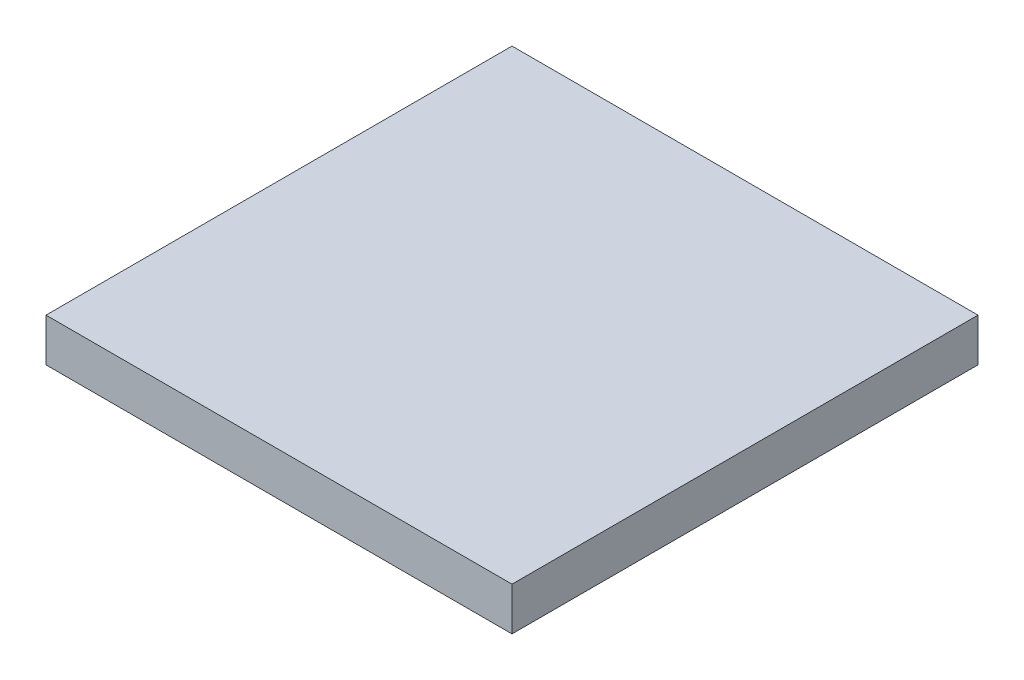
ISO-10303-21;
HEADER;
FILE_DESCRIPTION(('STEP AP214'),'2;1');
FILE_NAME('part.step','',(''),(''),'','','');
FILE_SCHEMA(('AUTOMOTIVE_DESIGN { 1 0 10303 214 1 1 1 1 }'));
ENDSEC;
DATA;
#1=APPLICATION_CONTEXT('core data for automotive mechanical design processes');
#2=APPLICATION_PROTOCOL_DEFINITION('international standard','automotive_design',2000,#1);
#3=PRODUCT_CONTEXT('',#1,'mechanical');
#4=PRODUCT('Part','Part','',(#3));
#5=PRODUCT_RELATED_PRODUCT_CATEGORY('part','',(#4));
#6=PRODUCT_DEFINITION_FORMATION('','',#4);
#7=PRODUCT_DEFINITION_CONTEXT('part definition',#1,'design');
#8=PRODUCT_DEFINITION('design','',#6,#7);
#9=PRODUCT_DEFINITION_SHAPE('','',#8);
#10=(LENGTH_UNIT() NAMED_UNIT(*) SI_UNIT(.MILLI.,.METRE.));
#11=(NAMED_UNIT(*) PLANE_ANGLE_UNIT() SI_UNIT($,.RADIAN.));
#12=(NAMED_UNIT(*) SI_UNIT($,.STERADIAN.) SOLID_ANGLE_UNIT());
#13=UNCERTAINTY_MEASURE_WITH_UNIT(LENGTH_MEASURE(1.E-05),#10,'distance_accuracy_value','');
#14=(GEOMETRIC_REPRESENTATION_CONTEXT(3) GLOBAL_UNCERTAINTY_ASSIGNED_CONTEXT((#13)) GLOBAL_UNIT_ASSIGNED_CONTEXT((#10,
#11,#12)) REPRESENTATION_CONTEXT('',''));
#15=CARTESIAN_POINT('',(0.,0.,0.));
#16=DIRECTION('',(0.,0.,1.));
#17=DIRECTION('',(1.,0.,0.));
#18=AXIS2_PLACEMENT_3D('',#15,#16,#17);
#19=CARTESIAN_POINT('',(274.6375,50.8,-274.6375));
#20=DIRECTION('',(-1.,0.,0.));
#21=DIRECTION('',(0.,0.,1.));
#22=AXIS2_PLACEMENT_3D('',#19,#20,#21);
#23=PLANE('',#22);
#24=DIRECTION('',(0.,0.,-1.));
#25=VECTOR('',#24,1.);
#26=CARTESIAN_POINT('',(274.6375,0.,-274.6375));
#27=LINE('',#26,#25);
#28=CARTESIAN_POINT('',(274.6375,0.,274.6375));
#29=VERTEX_POINT('',#28);
#30=CARTESIAN_POINT('',(274.6375,0.,-274.6375));
#31=VERTEX_POINT('',#30);
#32=EDGE_CURVE('E96',#29,#31,#27,.T.);
#33=ORIENTED_EDGE('',*,*,#32,.T.);
#34=DIRECTION('',(0.,-1.,0.));
#35=VECTOR('',#34,1.);
#36=CARTESIAN_POINT('',(274.6375,50.8,-274.6375));
#37=LINE('',#36,#35);
#38=CARTESIAN_POINT('',(274.6375,50.8,-274.6375));
#39=VERTEX_POINT('',#38);
#40=EDGE_CURVE('E11',#39,#31,#37,.T.);
#41=ORIENTED_EDGE('',*,*,#40,.F.);
#42=DIRECTION('',(0.,0.,-1.));
#43=VECTOR('',#42,1.);
#44=CARTESIAN_POINT('',(274.6375,50.8,-274.6375));
#45=LINE('',#44,#43);
#46=CARTESIAN_POINT('',(274.6375,50.8,274.6375));
#47=VERTEX_POINT('',#46);
#48=EDGE_CURVE('E84',#47,#39,#45,.T.);
#49=ORIENTED_EDGE('',*,*,#48,.F.);
#50=DIRECTION('',(0.,-1.,0.));
#51=VECTOR('',#50,1.);
#52=CARTESIAN_POINT('',(274.6375,50.8,274.6375));
#53=LINE('',#52,#51);
#54=EDGE_CURVE('E92',#47,#29,#53,.T.);
#55=ORIENTED_EDGE('',*,*,#54,.T.);
#56=EDGE_LOOP('',(#33,#41,#49,#55));
#57=FACE_BOUND('',#56,.T.);
#58=ADVANCED_FACE('F33',(#57),#23,.F.);
#59=CARTESIAN_POINT('',(-274.6375,50.8,-274.6375));
#60=DIRECTION('',(0.,0.,1.));
#61=DIRECTION('',(1.,0.,0.));
#62=AXIS2_PLACEMENT_3D('',#59,#60,#61);
#63=PLANE('',#62);
#64=DIRECTION('',(-1.,0.,0.));
#65=VECTOR('',#64,1.);
#66=CARTESIAN_POINT('',(-274.6375,0.,-274.6375));
#67=LINE('',#66,#65);
#68=CARTESIAN_POINT('',(-274.6375,0.,-274.6375));
#69=VERTEX_POINT('',#68);
#70=EDGE_CURVE('E88',#31,#69,#67,.T.);
#71=ORIENTED_EDGE('',*,*,#70,.T.);
#72=DIRECTION('',(0.,-1.,0.));
#73=VECTOR('',#72,1.);
#74=CARTESIAN_POINT('',(-274.6375,50.8,-274.6375));
#75=LINE('',#74,#73);
#76=CARTESIAN_POINT('',(-274.6375,50.8,-274.6375));
#77=VERTEX_POINT('',#76);
#78=EDGE_CURVE('E41',#77,#69,#75,.T.);
#79=ORIENTED_EDGE('',*,*,#78,.F.);
#80=DIRECTION('',(-1.,0.,0.));
#81=VECTOR('',#80,1.);
#82=CARTESIAN_POINT('',(-274.6375,50.8,-274.6375));
#83=LINE('',#82,#81);
#84=EDGE_CURVE('E79',#39,#77,#83,.T.);
#85=ORIENTED_EDGE('',*,*,#84,.F.);
#86=ORIENTED_EDGE('',*,*,#40,.T.);
#87=EDGE_LOOP('',(#71,#79,#85,#86));
#88=FACE_BOUND('',#87,.T.);
#89=ADVANCED_FACE('F87',(#88),#63,.F.);
#90=CARTESIAN_POINT('',(-274.6375,50.8,-274.6375));
#91=DIRECTION('',(1.,0.,0.));
#92=DIRECTION('',(0.,0.,-1.));
#93=AXIS2_PLACEMENT_3D('',#90,#91,#92);
#94=PLANE('',#93);
#95=DIRECTION('',(0.,0.,1.));
#96=VECTOR('',#95,1.);
#97=CARTESIAN_POINT('',(-274.6375,0.,-274.6375));
#98=LINE('',#97,#96);
#99=CARTESIAN_POINT('',(-274.6375,0.,274.6375));
#100=VERTEX_POINT('',#99);
#101=EDGE_CURVE('E66',#69,#100,#98,.T.);
#102=ORIENTED_EDGE('',*,*,#101,.T.);
#103=DIRECTION('',(0.,-1.,0.));
#104=VECTOR('',#103,1.);
#105=CARTESIAN_POINT('',(-274.6375,50.8,274.6375));
#106=LINE('',#105,#104);
#107=CARTESIAN_POINT('',(-274.6375,50.8,274.6375));
#108=VERTEX_POINT('',#107);
#109=EDGE_CURVE('E89',#108,#100,#106,.T.);
#110=ORIENTED_EDGE('',*,*,#109,.F.);
#111=DIRECTION('',(0.,0.,1.));
#112=VECTOR('',#111,1.);
#113=CARTESIAN_POINT('',(-274.6375,50.8,-274.6375));
#114=LINE('',#113,#112);
#115=EDGE_CURVE('E82',#77,#108,#114,.T.);
#116=ORIENTED_EDGE('',*,*,#115,.F.);
#117=ORIENTED_EDGE('',*,*,#78,.T.);
#118=EDGE_LOOP('',(#102,#110,#116,#117));
#119=FACE_BOUND('',#118,.T.);
#120=ADVANCED_FACE('F90',(#119),#94,.F.);
#121=CARTESIAN_POINT('',(-274.6375,50.8,274.6375));
#122=DIRECTION('',(0.,0.,-1.));
#123=DIRECTION('',(-1.,0.,0.));
#124=AXIS2_PLACEMENT_3D('',#121,#122,#123);
#125=PLANE('',#124);
#126=DIRECTION('',(1.,0.,0.));
#127=VECTOR('',#126,1.);
#128=CARTESIAN_POINT('',(-274.6375,0.,274.6375));
#129=LINE('',#128,#127);
#130=EDGE_CURVE('E72',#100,#29,#129,.T.);
#131=ORIENTED_EDGE('',*,*,#130,.T.);
#132=ORIENTED_EDGE('',*,*,#54,.F.);
#133=DIRECTION('',(1.,0.,0.));
#134=VECTOR('',#133,1.);
#135=CARTESIAN_POINT('',(-274.6375,50.8,274.6375));
#136=LINE('',#135,#134);
#137=EDGE_CURVE('E49',#108,#47,#136,.T.);
#138=ORIENTED_EDGE('',*,*,#137,.F.);
#139=ORIENTED_EDGE('',*,*,#109,.T.);
#140=EDGE_LOOP('',(#131,#132,#138,#139));
#141=FACE_BOUND('',#140,.T.);
#142=ADVANCED_FACE('F103',(#141),#125,.F.);
#143=CARTESIAN_POINT('',(0.,50.8,0.));
#144=DIRECTION('',(0.,1.,0.));
#145=DIRECTION('',(0.,0.,1.));
#146=AXIS2_PLACEMENT_3D('',#143,#144,#145);
#147=PLANE('',#146);
#148=ORIENTED_EDGE('',*,*,#48,.T.);
#149=ORIENTED_EDGE('',*,*,#84,.T.);
#150=ORIENTED_EDGE('',*,*,#115,.T.);
#151=ORIENTED_EDGE('',*,*,#137,.T.);
#152=EDGE_LOOP('',(#148,#149,#150,#151));
#153=FACE_BOUND('',#152,.T.);
#154=ADVANCED_FACE('F80',(#153),#147,.T.);
#155=CARTESIAN_POINT('',(0.,0.,0.));
#156=DIRECTION('',(0.,1.,0.));
#157=DIRECTION('',(0.,0.,1.));
#158=AXIS2_PLACEMENT_3D('',#155,#156,#157);
#159=PLANE('',#158);
#160=ORIENTED_EDGE('',*,*,#32,.F.);
#161=ORIENTED_EDGE('',*,*,#130,.F.);
#162=ORIENTED_EDGE('',*,*,#101,.F.);
#163=ORIENTED_EDGE('',*,*,#70,.F.);
#164=EDGE_LOOP('',(#160,#161,#162,#163));
#165=FACE_BOUND('',#164,.T.);
#166=ADVANCED_FACE('F106',(#165),#159,.F.);
#167=CLOSED_SHELL('',(#58,#89,#120,#142,#154,#166));
#168=MANIFOLD_SOLID_BREP('B2',#167);
#169=ADVANCED_BREP_SHAPE_REPRESENTATION('',(#18,#168),#14);
#170=SHAPE_DEFINITION_REPRESENTATION(#9,#169);
ENDSEC;
END-ISO-10303-21;
